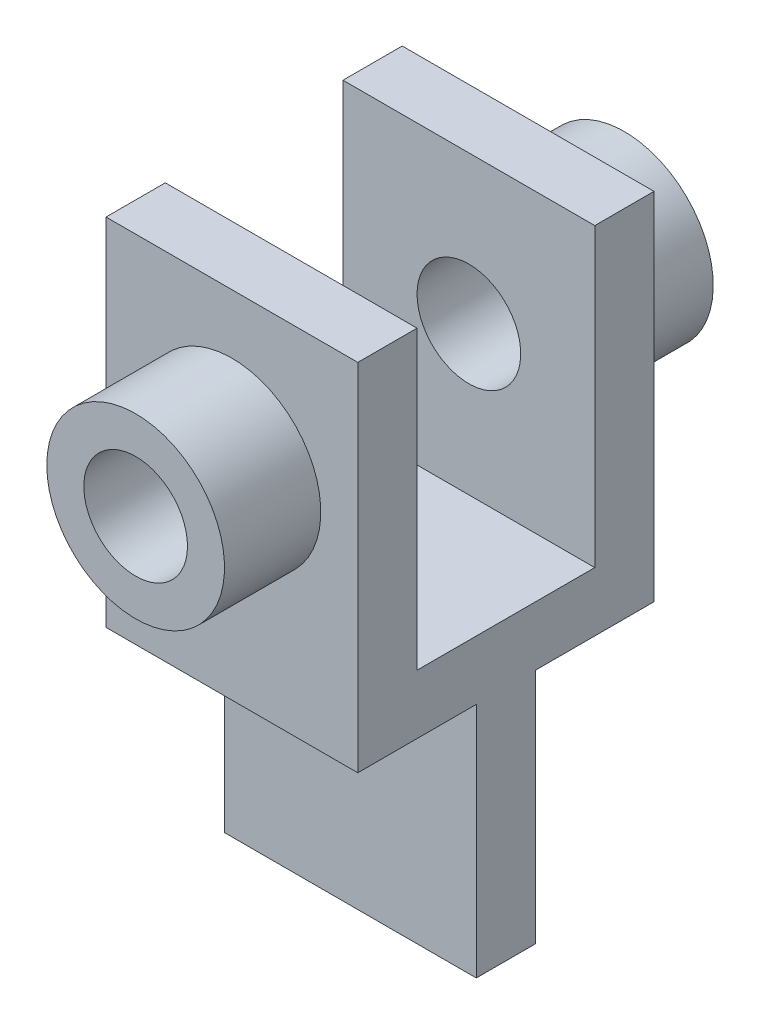
ISO-10303-21;
HEADER;
FILE_DESCRIPTION(('STEP AP214'),'2;1');
FILE_NAME('part.step','',(''),(''),'','','');
FILE_SCHEMA(('AUTOMOTIVE_DESIGN { 1 0 10303 214 1 1 1 1 }'));
ENDSEC;
DATA;
#1=APPLICATION_CONTEXT('core data for automotive mechanical design processes');
#2=APPLICATION_PROTOCOL_DEFINITION('international standard','automotive_design',2000,#1);
#3=PRODUCT_CONTEXT('',#1,'mechanical');
#4=PRODUCT('Part','Part','',(#3));
#5=PRODUCT_RELATED_PRODUCT_CATEGORY('part','',(#4));
#6=PRODUCT_DEFINITION_FORMATION('','',#4);
#7=PRODUCT_DEFINITION_CONTEXT('part definition',#1,'design');
#8=PRODUCT_DEFINITION('design','',#6,#7);
#9=PRODUCT_DEFINITION_SHAPE('','',#8);
#10=(LENGTH_UNIT() NAMED_UNIT(*) SI_UNIT(.MILLI.,.METRE.));
#11=(NAMED_UNIT(*) PLANE_ANGLE_UNIT() SI_UNIT($,.RADIAN.));
#12=(NAMED_UNIT(*) SI_UNIT($,.STERADIAN.) SOLID_ANGLE_UNIT());
#13=UNCERTAINTY_MEASURE_WITH_UNIT(LENGTH_MEASURE(1.E-05),#10,'distance_accuracy_value','');
#14=(GEOMETRIC_REPRESENTATION_CONTEXT(3) GLOBAL_UNCERTAINTY_ASSIGNED_CONTEXT((#13)) GLOBAL_UNIT_ASSIGNED_CONTEXT((#10,
#11,#12)) REPRESENTATION_CONTEXT('',''));
#15=CARTESIAN_POINT('',(0.,0.,0.));
#16=DIRECTION('',(0.,0.,1.));
#17=DIRECTION('',(1.,0.,0.));
#18=AXIS2_PLACEMENT_3D('',#15,#16,#17);
#19=CARTESIAN_POINT('',(17.,80.,-24.));
#20=DIRECTION('',(0.,0.,1.));
#21=DIRECTION('',(0.,-1.,0.));
#22=AXIS2_PLACEMENT_3D('',#19,#20,#21);
#23=PLANE('',#22);
#24=DIRECTION('',(0.,1.,0.));
#25=VECTOR('',#24,1.);
#26=CARTESIAN_POINT('',(-17.,80.,-24.));
#27=LINE('',#26,#25);
#28=CARTESIAN_POINT('',(-17.,32.,-24.));
#29=VERTEX_POINT('',#28);
#30=CARTESIAN_POINT('',(-17.,80.,-24.));
#31=VERTEX_POINT('',#30);
#32=EDGE_CURVE('E170',#29,#31,#27,.T.);
#33=ORIENTED_EDGE('',*,*,#32,.T.);
#34=DIRECTION('',(-1.,0.,0.));
#35=VECTOR('',#34,1.);
#36=CARTESIAN_POINT('',(17.,80.,-24.));
#37=LINE('',#36,#35);
#38=CARTESIAN_POINT('',(17.,80.,-24.));
#39=VERTEX_POINT('',#38);
#40=EDGE_CURVE('E201',#39,#31,#37,.T.);
#41=ORIENTED_EDGE('',*,*,#40,.F.);
#42=DIRECTION('',(0.,1.,0.));
#43=VECTOR('',#42,1.);
#44=CARTESIAN_POINT('',(17.,80.,-24.));
#45=LINE('',#44,#43);
#46=CARTESIAN_POINT('',(17.,32.,-24.));
#47=VERTEX_POINT('',#46);
#48=EDGE_CURVE('E274',#47,#39,#45,.T.);
#49=ORIENTED_EDGE('',*,*,#48,.F.);
#50=DIRECTION('',(-1.,0.,0.));
#51=VECTOR('',#50,1.);
#52=CARTESIAN_POINT('',(17.,32.,-24.));
#53=LINE('',#52,#51);
#54=EDGE_CURVE('E204',#47,#29,#53,.T.);
#55=ORIENTED_EDGE('',*,*,#54,.T.);
#56=EDGE_LOOP('',(#33,#41,#49,#55));
#57=FACE_BOUND('',#56,.T.);
#58=CARTESIAN_POINT('',(0.,60.,-24.));
#59=DIRECTION('',(0.,0.,1.));
#60=DIRECTION('',(0.,-1.,0.));
#61=AXIS2_PLACEMENT_3D('',#58,#59,#60);
#62=CIRCLE('',#61,12.);
#63=CARTESIAN_POINT('',(0.,48.,-24.));
#64=VERTEX_POINT('',#63);
#65=EDGE_CURVE('E11',#64,#64,#62,.F.);
#66=ORIENTED_EDGE('',*,*,#65,.F.);
#67=EDGE_LOOP('',(#66));
#68=FACE_BOUND('',#67,.T.);
#69=ADVANCED_FACE('F39',(#57,#68),#23,.F.);
#70=CARTESIAN_POINT('',(17.,32.,16.));
#71=DIRECTION('',(0.,0.,-1.));
#72=DIRECTION('',(-1.,0.,0.));
#73=AXIS2_PLACEMENT_3D('',#70,#71,#72);
#74=PLANE('',#73);
#75=DIRECTION('',(0.,-1.,0.));
#76=VECTOR('',#75,1.);
#77=CARTESIAN_POINT('',(-17.,32.,16.));
#78=LINE('',#77,#76);
#79=CARTESIAN_POINT('',(-17.,80.,16.));
#80=VERTEX_POINT('',#79);
#81=CARTESIAN_POINT('',(-17.,32.,16.));
#82=VERTEX_POINT('',#81);
#83=EDGE_CURVE('E152',#80,#82,#78,.T.);
#84=ORIENTED_EDGE('',*,*,#83,.T.);
#85=DIRECTION('',(-1.,0.,0.));
#86=VECTOR('',#85,1.);
#87=CARTESIAN_POINT('',(17.,32.,16.));
#88=LINE('',#87,#86);
#89=CARTESIAN_POINT('',(17.,32.,16.));
#90=VERTEX_POINT('',#89);
#91=EDGE_CURVE('E148',#90,#82,#88,.T.);
#92=ORIENTED_EDGE('',*,*,#91,.F.);
#93=DIRECTION('',(0.,-1.,0.));
#94=VECTOR('',#93,1.);
#95=CARTESIAN_POINT('',(17.,32.,16.));
#96=LINE('',#95,#94);
#97=CARTESIAN_POINT('',(17.,80.,16.));
#98=VERTEX_POINT('',#97);
#99=EDGE_CURVE('E137',#98,#90,#96,.T.);
#100=ORIENTED_EDGE('',*,*,#99,.F.);
#101=DIRECTION('',(-1.,0.,0.));
#102=VECTOR('',#101,1.);
#103=CARTESIAN_POINT('',(17.,80.,16.));
#104=LINE('',#103,#102);
#105=EDGE_CURVE('E153',#98,#80,#104,.T.);
#106=ORIENTED_EDGE('',*,*,#105,.T.);
#107=EDGE_LOOP('',(#84,#92,#100,#106));
#108=FACE_BOUND('',#107,.T.);
#109=CARTESIAN_POINT('',(0.,60.,16.));
#110=DIRECTION('',(0.,0.,-1.));
#111=DIRECTION('',(-1.,0.,0.));
#112=AXIS2_PLACEMENT_3D('',#109,#110,#111);
#113=CIRCLE('',#112,12.);
#114=CARTESIAN_POINT('',(-12.,60.,16.));
#115=VERTEX_POINT('',#114);
#116=EDGE_CURVE('E48',#115,#115,#113,.F.);
#117=ORIENTED_EDGE('',*,*,#116,.F.);
#118=EDGE_LOOP('',(#117));
#119=FACE_BOUND('',#118,.T.);
#120=ADVANCED_FACE('F149',(#108,#119),#74,.F.);
#121=CARTESIAN_POINT('',(17.,0.,-8.00000000000001));
#122=DIRECTION('',(0.,1.,0.));
#123=DIRECTION('',(0.,0.,1.));
#124=AXIS2_PLACEMENT_3D('',#121,#122,#123);
#125=PLANE('',#124);
#126=DIRECTION('',(0.,0.,-1.));
#127=VECTOR('',#126,1.);
#128=CARTESIAN_POINT('',(-17.,0.,-8.00000000000001));
#129=LINE('',#128,#127);
#130=CARTESIAN_POINT('',(-17.,0.,0.));
#131=VERTEX_POINT('',#130);
#132=CARTESIAN_POINT('',(-17.,0.,-8.00000000000001));
#133=VERTEX_POINT('',#132);
#134=EDGE_CURVE('E162',#131,#133,#129,.T.);
#135=ORIENTED_EDGE('',*,*,#134,.T.);
#136=DIRECTION('',(-1.,0.,0.));
#137=VECTOR('',#136,1.);
#138=CARTESIAN_POINT('',(17.,0.,-8.00000000000001));
#139=LINE('',#138,#137);
#140=CARTESIAN_POINT('',(17.,0.,-8.00000000000001));
#141=VERTEX_POINT('',#140);
#142=EDGE_CURVE('E210',#141,#133,#139,.T.);
#143=ORIENTED_EDGE('',*,*,#142,.F.);
#144=DIRECTION('',(0.,0.,-1.));
#145=VECTOR('',#144,1.);
#146=CARTESIAN_POINT('',(17.,0.,-8.00000000000001));
#147=LINE('',#146,#145);
#148=CARTESIAN_POINT('',(17.,0.,0.));
#149=VERTEX_POINT('',#148);
#150=EDGE_CURVE('E185',#149,#141,#147,.T.);
#151=ORIENTED_EDGE('',*,*,#150,.F.);
#152=DIRECTION('',(-1.,0.,0.));
#153=VECTOR('',#152,1.);
#154=CARTESIAN_POINT('',(17.,0.,0.));
#155=LINE('',#154,#153);
#156=EDGE_CURVE('E158',#149,#131,#155,.T.);
#157=ORIENTED_EDGE('',*,*,#156,.T.);
#158=EDGE_LOOP('',(#135,#143,#151,#157));
#159=FACE_BOUND('',#158,.T.);
#160=ADVANCED_FACE('F41',(#159),#125,.F.);
#161=CARTESIAN_POINT('',(17.,32.,-8.));
#162=DIRECTION('',(0.,0.,1.));
#163=DIRECTION('',(0.,-1.,0.));
#164=AXIS2_PLACEMENT_3D('',#161,#162,#163);
#165=PLANE('',#164);
#166=DIRECTION('',(0.,1.,0.));
#167=VECTOR('',#166,1.);
#168=CARTESIAN_POINT('',(-17.,32.,-8.));
#169=LINE('',#168,#167);
#170=CARTESIAN_POINT('',(-17.,32.,-8.));
#171=VERTEX_POINT('',#170);
#172=EDGE_CURVE('E165',#133,#171,#169,.T.);
#173=ORIENTED_EDGE('',*,*,#172,.T.);
#174=DIRECTION('',(-1.,0.,0.));
#175=VECTOR('',#174,1.);
#176=CARTESIAN_POINT('',(17.,32.,-8.));
#177=LINE('',#176,#175);
#178=CARTESIAN_POINT('',(17.,32.,-8.));
#179=VERTEX_POINT('',#178);
#180=EDGE_CURVE('E207',#179,#171,#177,.T.);
#181=ORIENTED_EDGE('',*,*,#180,.F.);
#182=DIRECTION('',(0.,1.,0.));
#183=VECTOR('',#182,1.);
#184=CARTESIAN_POINT('',(17.,32.,-8.));
#185=LINE('',#184,#183);
#186=EDGE_CURVE('E112',#141,#179,#185,.T.);
#187=ORIENTED_EDGE('',*,*,#186,.F.);
#188=ORIENTED_EDGE('',*,*,#142,.T.);
#189=EDGE_LOOP('',(#173,#181,#187,#188));
#190=FACE_BOUND('',#189,.T.);
#191=ADVANCED_FACE('F222',(#190),#165,.F.);
#192=CARTESIAN_POINT('',(17.,32.,-24.));
#193=DIRECTION('',(0.,1.,0.));
#194=DIRECTION('',(0.,0.,1.));
#195=AXIS2_PLACEMENT_3D('',#192,#193,#194);
#196=PLANE('',#195);
#197=DIRECTION('',(0.,0.,-1.));
#198=VECTOR('',#197,1.);
#199=CARTESIAN_POINT('',(-17.,32.,-24.));
#200=LINE('',#199,#198);
#201=EDGE_CURVE('E168',#171,#29,#200,.T.);
#202=ORIENTED_EDGE('',*,*,#201,.T.);
#203=ORIENTED_EDGE('',*,*,#54,.F.);
#204=DIRECTION('',(0.,0.,-1.));
#205=VECTOR('',#204,1.);
#206=CARTESIAN_POINT('',(17.,32.,-24.));
#207=LINE('',#206,#205);
#208=EDGE_CURVE('E261',#179,#47,#207,.T.);
#209=ORIENTED_EDGE('',*,*,#208,.F.);
#210=ORIENTED_EDGE('',*,*,#180,.T.);
#211=EDGE_LOOP('',(#202,#203,#209,#210));
#212=FACE_BOUND('',#211,.T.);
#213=ADVANCED_FACE('F247',(#212),#196,.F.);
#214=CARTESIAN_POINT('',(17.,80.,-16.));
#215=DIRECTION('',(0.,-1.,0.));
#216=DIRECTION('',(0.,0.,-1.));
#217=AXIS2_PLACEMENT_3D('',#214,#215,#216);
#218=PLANE('',#217);
#219=DIRECTION('',(0.,0.,1.));
#220=VECTOR('',#219,1.);
#221=CARTESIAN_POINT('',(-17.,80.,-16.));
#222=LINE('',#221,#220);
#223=CARTESIAN_POINT('',(-17.,80.,-16.));
#224=VERTEX_POINT('',#223);
#225=EDGE_CURVE('E172',#31,#224,#222,.T.);
#226=ORIENTED_EDGE('',*,*,#225,.T.);
#227=DIRECTION('',(-1.,0.,0.));
#228=VECTOR('',#227,1.);
#229=CARTESIAN_POINT('',(17.,80.,-16.));
#230=LINE('',#229,#228);
#231=CARTESIAN_POINT('',(17.,80.,-16.));
#232=VERTEX_POINT('',#231);
#233=EDGE_CURVE('E198',#232,#224,#230,.T.);
#234=ORIENTED_EDGE('',*,*,#233,.F.);
#235=DIRECTION('',(0.,0.,1.));
#236=VECTOR('',#235,1.);
#237=CARTESIAN_POINT('',(17.,80.,-16.));
#238=LINE('',#237,#236);
#239=EDGE_CURVE('E271',#39,#232,#238,.T.);
#240=ORIENTED_EDGE('',*,*,#239,.F.);
#241=ORIENTED_EDGE('',*,*,#40,.T.);
#242=EDGE_LOOP('',(#226,#234,#240,#241));
#243=FACE_BOUND('',#242,.T.);
#244=ADVANCED_FACE('F244',(#243),#218,.F.);
#245=CARTESIAN_POINT('',(17.,40.,-16.));
#246=DIRECTION('',(0.,0.,-1.));
#247=DIRECTION('',(-1.,0.,0.));
#248=AXIS2_PLACEMENT_3D('',#245,#246,#247);
#249=PLANE('',#248);
#250=CARTESIAN_POINT('',(0.,60.,-16.));
#251=DIRECTION('',(0.,0.,-1.));
#252=DIRECTION('',(-1.,0.,0.));
#253=AXIS2_PLACEMENT_3D('',#250,#251,#252);
#254=CIRCLE('',#253,7.);
#255=CARTESIAN_POINT('',(-7.,60.,-16.));
#256=VERTEX_POINT('',#255);
#257=EDGE_CURVE('E166',#256,#256,#254,.T.);
#258=ORIENTED_EDGE('',*,*,#257,.T.);
#259=EDGE_LOOP('',(#258));
#260=FACE_BOUND('',#259,.T.);
#261=DIRECTION('',(0.,-1.,0.));
#262=VECTOR('',#261,1.);
#263=CARTESIAN_POINT('',(-17.,40.,-16.));
#264=LINE('',#263,#262);
#265=CARTESIAN_POINT('',(-17.,40.,-16.));
#266=VERTEX_POINT('',#265);
#267=EDGE_CURVE('E174',#224,#266,#264,.T.);
#268=ORIENTED_EDGE('',*,*,#267,.T.);
#269=DIRECTION('',(-1.,0.,0.));
#270=VECTOR('',#269,1.);
#271=CARTESIAN_POINT('',(17.,40.,-16.));
#272=LINE('',#271,#270);
#273=CARTESIAN_POINT('',(17.,40.,-16.));
#274=VERTEX_POINT('',#273);
#275=EDGE_CURVE('E195',#274,#266,#272,.T.);
#276=ORIENTED_EDGE('',*,*,#275,.F.);
#277=DIRECTION('',(0.,-1.,0.));
#278=VECTOR('',#277,1.);
#279=CARTESIAN_POINT('',(17.,40.,-16.));
#280=LINE('',#279,#278);
#281=EDGE_CURVE('E273',#232,#274,#280,.T.);
#282=ORIENTED_EDGE('',*,*,#281,.F.);
#283=ORIENTED_EDGE('',*,*,#233,.T.);
#284=EDGE_LOOP('',(#268,#276,#282,#283));
#285=FACE_BOUND('',#284,.T.);
#286=ADVANCED_FACE('F240',(#260,#285),#249,.F.);
#287=CARTESIAN_POINT('',(17.,40.,8.));
#288=DIRECTION('',(0.,-1.,0.));
#289=DIRECTION('',(0.,0.,-1.));
#290=AXIS2_PLACEMENT_3D('',#287,#288,#289);
#291=PLANE('',#290);
#292=DIRECTION('',(0.,0.,1.));
#293=VECTOR('',#292,1.);
#294=CARTESIAN_POINT('',(-17.,40.,8.));
#295=LINE('',#294,#293);
#296=CARTESIAN_POINT('',(-17.,40.,8.));
#297=VERTEX_POINT('',#296);
#298=EDGE_CURVE('E176',#266,#297,#295,.T.);
#299=ORIENTED_EDGE('',*,*,#298,.T.);
#300=DIRECTION('',(-1.,0.,0.));
#301=VECTOR('',#300,1.);
#302=CARTESIAN_POINT('',(17.,40.,8.));
#303=LINE('',#302,#301);
#304=CARTESIAN_POINT('',(17.,40.,8.));
#305=VERTEX_POINT('',#304);
#306=EDGE_CURVE('E192',#305,#297,#303,.T.);
#307=ORIENTED_EDGE('',*,*,#306,.F.);
#308=DIRECTION('',(0.,0.,1.));
#309=VECTOR('',#308,1.);
#310=CARTESIAN_POINT('',(17.,40.,8.));
#311=LINE('',#310,#309);
#312=EDGE_CURVE('E276',#274,#305,#311,.T.);
#313=ORIENTED_EDGE('',*,*,#312,.F.);
#314=ORIENTED_EDGE('',*,*,#275,.T.);
#315=EDGE_LOOP('',(#299,#307,#313,#314));
#316=FACE_BOUND('',#315,.T.);
#317=ADVANCED_FACE('F236',(#316),#291,.F.);
#318=CARTESIAN_POINT('',(17.,80.,8.));
#319=DIRECTION('',(0.,0.,1.));
#320=DIRECTION('',(0.,-1.,0.));
#321=AXIS2_PLACEMENT_3D('',#318,#319,#320);
#322=PLANE('',#321);
#323=CARTESIAN_POINT('',(0.,60.,8.));
#324=DIRECTION('',(0.,0.,1.));
#325=DIRECTION('',(0.,-1.,0.));
#326=AXIS2_PLACEMENT_3D('',#323,#324,#325);
#327=CIRCLE('',#326,7.);
#328=CARTESIAN_POINT('',(0.,53.,8.));
#329=VERTEX_POINT('',#328);
#330=EDGE_CURVE('E339',#329,#329,#327,.T.);
#331=ORIENTED_EDGE('',*,*,#330,.T.);
#332=EDGE_LOOP('',(#331));
#333=FACE_BOUND('',#332,.T.);
#334=DIRECTION('',(0.,1.,0.));
#335=VECTOR('',#334,1.);
#336=CARTESIAN_POINT('',(-17.,80.,8.));
#337=LINE('',#336,#335);
#338=CARTESIAN_POINT('',(-17.,80.,8.));
#339=VERTEX_POINT('',#338);
#340=EDGE_CURVE('E178',#297,#339,#337,.T.);
#341=ORIENTED_EDGE('',*,*,#340,.T.);
#342=DIRECTION('',(-1.,0.,0.));
#343=VECTOR('',#342,1.);
#344=CARTESIAN_POINT('',(17.,80.,8.));
#345=LINE('',#344,#343);
#346=CARTESIAN_POINT('',(17.,80.,8.));
#347=VERTEX_POINT('',#346);
#348=EDGE_CURVE('E189',#347,#339,#345,.T.);
#349=ORIENTED_EDGE('',*,*,#348,.F.);
#350=DIRECTION('',(0.,1.,0.));
#351=VECTOR('',#350,1.);
#352=CARTESIAN_POINT('',(17.,80.,8.));
#353=LINE('',#352,#351);
#354=EDGE_CURVE('E282',#305,#347,#353,.T.);
#355=ORIENTED_EDGE('',*,*,#354,.F.);
#356=ORIENTED_EDGE('',*,*,#306,.T.);
#357=EDGE_LOOP('',(#341,#349,#355,#356));
#358=FACE_BOUND('',#357,.T.);
#359=ADVANCED_FACE('F233',(#333,#358),#322,.F.);
#360=CARTESIAN_POINT('',(17.,80.,16.));
#361=DIRECTION('',(0.,-1.,0.));
#362=DIRECTION('',(0.,0.,-1.));
#363=AXIS2_PLACEMENT_3D('',#360,#361,#362);
#364=PLANE('',#363);
#365=DIRECTION('',(0.,0.,1.));
#366=VECTOR('',#365,1.);
#367=CARTESIAN_POINT('',(-17.,80.,16.));
#368=LINE('',#367,#366);
#369=EDGE_CURVE('E180',#339,#80,#368,.T.);
#370=ORIENTED_EDGE('',*,*,#369,.T.);
#371=ORIENTED_EDGE('',*,*,#105,.F.);
#372=DIRECTION('',(0.,0.,1.));
#373=VECTOR('',#372,1.);
#374=CARTESIAN_POINT('',(17.,80.,16.));
#375=LINE('',#374,#373);
#376=EDGE_CURVE('E143',#347,#98,#375,.T.);
#377=ORIENTED_EDGE('',*,*,#376,.F.);
#378=ORIENTED_EDGE('',*,*,#348,.T.);
#379=EDGE_LOOP('',(#370,#371,#377,#378));
#380=FACE_BOUND('',#379,.T.);
#381=ADVANCED_FACE('F230',(#380),#364,.F.);
#382=CARTESIAN_POINT('',(17.,32.,0.));
#383=DIRECTION('',(0.,1.,0.));
#384=DIRECTION('',(0.,0.,1.));
#385=AXIS2_PLACEMENT_3D('',#382,#383,#384);
#386=PLANE('',#385);
#387=DIRECTION('',(0.,0.,-1.));
#388=VECTOR('',#387,1.);
#389=CARTESIAN_POINT('',(-17.,32.,0.));
#390=LINE('',#389,#388);
#391=CARTESIAN_POINT('',(-17.,32.,0.));
#392=VERTEX_POINT('',#391);
#393=EDGE_CURVE('E97',#82,#392,#390,.T.);
#394=ORIENTED_EDGE('',*,*,#393,.T.);
#395=DIRECTION('',(-1.,0.,0.));
#396=VECTOR('',#395,1.);
#397=CARTESIAN_POINT('',(17.,32.,0.));
#398=LINE('',#397,#396);
#399=CARTESIAN_POINT('',(17.,32.,0.));
#400=VERTEX_POINT('',#399);
#401=EDGE_CURVE('E154',#400,#392,#398,.T.);
#402=ORIENTED_EDGE('',*,*,#401,.F.);
#403=DIRECTION('',(0.,0.,-1.));
#404=VECTOR('',#403,1.);
#405=CARTESIAN_POINT('',(17.,32.,0.));
#406=LINE('',#405,#404);
#407=EDGE_CURVE('E141',#90,#400,#406,.T.);
#408=ORIENTED_EDGE('',*,*,#407,.F.);
#409=ORIENTED_EDGE('',*,*,#91,.T.);
#410=EDGE_LOOP('',(#394,#402,#408,#409));
#411=FACE_BOUND('',#410,.T.);
#412=ADVANCED_FACE('F156',(#411),#386,.F.);
#413=CARTESIAN_POINT('',(17.,0.,0.));
#414=DIRECTION('',(0.,0.,-1.));
#415=DIRECTION('',(0.,1.,0.));
#416=AXIS2_PLACEMENT_3D('',#413,#414,#415);
#417=PLANE('',#416);
#418=DIRECTION('',(0.,-1.,0.));
#419=VECTOR('',#418,1.);
#420=CARTESIAN_POINT('',(-17.,0.,0.));
#421=LINE('',#420,#419);
#422=EDGE_CURVE('E103',#392,#131,#421,.T.);
#423=ORIENTED_EDGE('',*,*,#422,.T.);
#424=ORIENTED_EDGE('',*,*,#156,.F.);
#425=DIRECTION('',(0.,-1.,0.));
#426=VECTOR('',#425,1.);
#427=CARTESIAN_POINT('',(17.,0.,0.));
#428=LINE('',#427,#426);
#429=EDGE_CURVE('E56',#400,#149,#428,.T.);
#430=ORIENTED_EDGE('',*,*,#429,.F.);
#431=ORIENTED_EDGE('',*,*,#401,.T.);
#432=EDGE_LOOP('',(#423,#424,#430,#431));
#433=FACE_BOUND('',#432,.T.);
#434=ADVANCED_FACE('F291',(#433),#417,.F.);
#435=CARTESIAN_POINT('',(17.,0.,0.));
#436=DIRECTION('',(-1.,0.,0.));
#437=DIRECTION('',(0.,0.,1.));
#438=AXIS2_PLACEMENT_3D('',#435,#436,#437);
#439=PLANE('',#438);
#440=ORIENTED_EDGE('',*,*,#150,.T.);
#441=ORIENTED_EDGE('',*,*,#186,.T.);
#442=ORIENTED_EDGE('',*,*,#208,.T.);
#443=ORIENTED_EDGE('',*,*,#48,.T.);
#444=ORIENTED_EDGE('',*,*,#239,.T.);
#445=ORIENTED_EDGE('',*,*,#281,.T.);
#446=ORIENTED_EDGE('',*,*,#312,.T.);
#447=ORIENTED_EDGE('',*,*,#354,.T.);
#448=ORIENTED_EDGE('',*,*,#376,.T.);
#449=ORIENTED_EDGE('',*,*,#99,.T.);
#450=ORIENTED_EDGE('',*,*,#407,.T.);
#451=ORIENTED_EDGE('',*,*,#429,.T.);
#452=EDGE_LOOP('',(#440,#441,#442,#443,#444,#445,#446,#447,#448,#449,#450,#451));
#453=FACE_BOUND('',#452,.T.);
#454=ADVANCED_FACE('F139',(#453),#439,.F.);
#455=CARTESIAN_POINT('',(-17.,0.,0.));
#456=DIRECTION('',(-1.,0.,0.));
#457=DIRECTION('',(0.,0.,1.));
#458=AXIS2_PLACEMENT_3D('',#455,#456,#457);
#459=PLANE('',#458);
#460=ORIENTED_EDGE('',*,*,#134,.F.);
#461=ORIENTED_EDGE('',*,*,#422,.F.);
#462=ORIENTED_EDGE('',*,*,#393,.F.);
#463=ORIENTED_EDGE('',*,*,#83,.F.);
#464=ORIENTED_EDGE('',*,*,#369,.F.);
#465=ORIENTED_EDGE('',*,*,#340,.F.);
#466=ORIENTED_EDGE('',*,*,#298,.F.);
#467=ORIENTED_EDGE('',*,*,#267,.F.);
#468=ORIENTED_EDGE('',*,*,#225,.F.);
#469=ORIENTED_EDGE('',*,*,#32,.F.);
#470=ORIENTED_EDGE('',*,*,#201,.F.);
#471=ORIENTED_EDGE('',*,*,#172,.F.);
#472=EDGE_LOOP('',(#460,#461,#462,#463,#464,#465,#466,#467,#468,#469,#470,#471));
#473=FACE_BOUND('',#472,.T.);
#474=ADVANCED_FACE('F263',(#473),#459,.T.);
#475=CARTESIAN_POINT('',(0.,60.,-24.));
#476=DIRECTION('',(0.,0.,1.));
#477=DIRECTION('',(1.,0.,0.));
#478=AXIS2_PLACEMENT_3D('',#475,#476,#477);
#479=CYLINDRICAL_SURFACE('',#478,7.);
#480=ORIENTED_EDGE('',*,*,#330,.F.);
#481=EDGE_LOOP('',(#480));
#482=FACE_BOUND('',#481,.T.);
#483=CARTESIAN_POINT('',(0.,60.,29.));
#484=DIRECTION('',(0.,0.,1.));
#485=DIRECTION('',(1.,0.,0.));
#486=AXIS2_PLACEMENT_3D('',#483,#484,#485);
#487=CIRCLE('',#486,7.);
#488=CARTESIAN_POINT('',(7.,60.,29.));
#489=VERTEX_POINT('',#488);
#490=EDGE_CURVE('E331',#489,#489,#487,.T.);
#491=ORIENTED_EDGE('',*,*,#490,.T.);
#492=EDGE_LOOP('',(#491));
#493=FACE_BOUND('',#492,.T.);
#494=ADVANCED_FACE('F300',(#482,#493),#479,.F.);
#495=ORIENTED_EDGE('',*,*,#257,.F.);
#496=EDGE_LOOP('',(#495));
#497=FACE_BOUND('',#496,.T.);
#498=CARTESIAN_POINT('',(0.,60.,-37.));
#499=DIRECTION('',(0.,0.,-1.));
#500=DIRECTION('',(0.,1.,0.));
#501=AXIS2_PLACEMENT_3D('',#498,#499,#500);
#502=CIRCLE('',#501,7.);
#503=CARTESIAN_POINT('',(0.,67.,-37.));
#504=VERTEX_POINT('',#503);
#505=EDGE_CURVE('E328',#504,#504,#502,.T.);
#506=ORIENTED_EDGE('',*,*,#505,.T.);
#507=EDGE_LOOP('',(#506));
#508=FACE_BOUND('',#507,.T.);
#509=ADVANCED_FACE('F302',(#497,#508),#479,.F.);
#510=CARTESIAN_POINT('',(0.,60.,29.));
#511=DIRECTION('',(0.,0.,1.));
#512=DIRECTION('',(1.,0.,0.));
#513=AXIS2_PLACEMENT_3D('',#510,#511,#512);
#514=PLANE('',#513);
#515=CARTESIAN_POINT('',(0.,60.,29.));
#516=DIRECTION('',(0.,0.,1.));
#517=DIRECTION('',(1.,0.,0.));
#518=AXIS2_PLACEMENT_3D('',#515,#516,#517);
#519=CIRCLE('',#518,12.);
#520=CARTESIAN_POINT('',(-12.,60.,29.));
#521=VERTEX_POINT('',#520);
#522=EDGE_CURVE('E336',#521,#521,#519,.T.);
#523=ORIENTED_EDGE('',*,*,#522,.T.);
#524=EDGE_LOOP('',(#523));
#525=FACE_BOUND('',#524,.T.);
#526=ORIENTED_EDGE('',*,*,#490,.F.);
#527=EDGE_LOOP('',(#526));
#528=FACE_BOUND('',#527,.T.);
#529=ADVANCED_FACE('F305',(#525,#528),#514,.T.);
#530=CARTESIAN_POINT('',(0.,60.,29.));
#531=DIRECTION('',(0.,0.,-1.));
#532=DIRECTION('',(-1.,0.,0.));
#533=AXIS2_PLACEMENT_3D('',#530,#531,#532);
#534=CYLINDRICAL_SURFACE('',#533,12.);
#535=CARTESIAN_POINT('',(-12.,60.,29.));
#536=CARTESIAN_POINT('',(-12.,60.,28.8645833333333));
#537=CARTESIAN_POINT('',(-12.,60.,28.7291666666667));
#538=CARTESIAN_POINT('',(-12.,60.,28.4583333333333));
#539=CARTESIAN_POINT('',(-12.,60.,28.3229166666667));
#540=CARTESIAN_POINT('',(-12.,60.,28.0520833333333));
#541=CARTESIAN_POINT('',(-12.,60.,27.9166666666667));
#542=CARTESIAN_POINT('',(-12.,60.,27.6458333333333));
#543=CARTESIAN_POINT('',(-12.,60.,27.5104166666667));
#544=CARTESIAN_POINT('',(-12.,60.,27.2395833333333));
#545=CARTESIAN_POINT('',(-12.,60.,27.1041666666667));
#546=CARTESIAN_POINT('',(-12.,60.,26.8333333333333));
#547=CARTESIAN_POINT('',(-12.,60.,26.6979166666667));
#548=CARTESIAN_POINT('',(-12.,60.,26.4270833333333));
#549=CARTESIAN_POINT('',(-12.,60.,26.2916666666667));
#550=CARTESIAN_POINT('',(-12.,60.,26.0208333333333));
#551=CARTESIAN_POINT('',(-12.,60.,25.8854166666667));
#552=CARTESIAN_POINT('',(-12.,60.,25.6145833333333));
#553=CARTESIAN_POINT('',(-12.,60.,25.4791666666667));
#554=CARTESIAN_POINT('',(-12.,60.,25.2083333333333));
#555=CARTESIAN_POINT('',(-12.,60.,25.0729166666667));
#556=CARTESIAN_POINT('',(-12.,60.,24.8020833333333));
#557=CARTESIAN_POINT('',(-12.,60.,24.6666666666667));
#558=CARTESIAN_POINT('',(-12.,60.,24.3958333333333));
#559=CARTESIAN_POINT('',(-12.,60.,24.2604166666667));
#560=CARTESIAN_POINT('',(-12.,60.,23.9895833333333));
#561=CARTESIAN_POINT('',(-12.,60.,23.8541666666667));
#562=CARTESIAN_POINT('',(-12.,60.,23.5833333333333));
#563=CARTESIAN_POINT('',(-12.,60.,23.4479166666667));
#564=CARTESIAN_POINT('',(-12.,60.,23.1770833333333));
#565=CARTESIAN_POINT('',(-12.,60.,23.0416666666667));
#566=CARTESIAN_POINT('',(-12.,60.,22.7708333333333));
#567=CARTESIAN_POINT('',(-12.,60.,22.6354166666667));
#568=CARTESIAN_POINT('',(-12.,60.,22.3645833333333));
#569=CARTESIAN_POINT('',(-12.,60.,22.2291666666667));
#570=CARTESIAN_POINT('',(-12.,60.,21.9583333333333));
#571=CARTESIAN_POINT('',(-12.,60.,21.8229166666667));
#572=CARTESIAN_POINT('',(-12.,60.,21.5520833333333));
#573=CARTESIAN_POINT('',(-12.,60.,21.4166666666667));
#574=CARTESIAN_POINT('',(-12.,60.,21.1458333333333));
#575=CARTESIAN_POINT('',(-12.,60.,21.0104166666667));
#576=CARTESIAN_POINT('',(-12.,60.,20.7395833333333));
#577=CARTESIAN_POINT('',(-12.,60.,20.6041666666667));
#578=CARTESIAN_POINT('',(-12.,60.,20.3333333333333));
#579=CARTESIAN_POINT('',(-12.,60.,20.1979166666667));
#580=CARTESIAN_POINT('',(-12.,60.,19.9270833333333));
#581=CARTESIAN_POINT('',(-12.,60.,19.7916666666667));
#582=CARTESIAN_POINT('',(-12.,60.,19.5208333333333));
#583=CARTESIAN_POINT('',(-12.,60.,19.3854166666667));
#584=CARTESIAN_POINT('',(-12.,60.,19.1145833333333));
#585=CARTESIAN_POINT('',(-12.,60.,18.9791666666667));
#586=CARTESIAN_POINT('',(-12.,60.,18.7083333333333));
#587=CARTESIAN_POINT('',(-12.,60.,18.5729166666667));
#588=CARTESIAN_POINT('',(-12.,60.,18.3020833333333));
#589=CARTESIAN_POINT('',(-12.,60.,18.1666666666667));
#590=CARTESIAN_POINT('',(-12.,60.,17.8958333333333));
#591=CARTESIAN_POINT('',(-12.,60.,17.7604166666667));
#592=CARTESIAN_POINT('',(-12.,60.,17.4895833333333));
#593=CARTESIAN_POINT('',(-12.,60.,17.3541666666667));
#594=CARTESIAN_POINT('',(-12.,60.,17.0833333333333));
#595=CARTESIAN_POINT('',(-12.,60.,16.9479166666667));
#596=CARTESIAN_POINT('',(-12.,60.,16.6770833333333));
#597=CARTESIAN_POINT('',(-12.,60.,16.5416666666667));
#598=CARTESIAN_POINT('',(-12.,60.,16.2708333333333));
#599=CARTESIAN_POINT('',(-12.,60.,16.1354166666667));
#600=CARTESIAN_POINT('',(-12.,60.,16.));
#601=B_SPLINE_CURVE_WITH_KNOTS('',3,(#535,#536,#537,#538,#539,#540,#541,#542,#543,#544,#545,
#546,#547,#548,#549,#550,#551,#552,#553,#554,#555,#556,#557,#558,#559,#560,#561,#562,#563,#564,
#565,#566,#567,#568,#569,#570,#571,#572,#573,#574,#575,#576,#577,#578,#579,#580,#581,#582,#583,
#584,#585,#586,#587,#588,#589,#590,#591,#592,#593,#594,#595,#596,#597,#598,#599,#600),
.UNSPECIFIED.,.F.,.F.,(4,2,2,2,2,2,2,2,2,2,2,2,2,2,2,2,2,2,2,2,2,2,2,2,2,2,2,2,2,2,2,2,4),(0.,
0.40625,0.812500000000001,1.21875,1.625,2.03125,2.4375,2.84375,3.25,3.65625,4.0625,4.46875,
4.875,5.28125,5.6875,6.09375,6.5,6.90625,7.3125,7.71875,8.125,8.53125,8.9375,9.34375,
9.74999999999999,10.15625,10.5625,10.96875,11.375,11.78125,12.1875,12.59375,13.),.UNSPECIFIED.);
#602=EDGE_CURVE('BSEAM214',#521,#115,#601,.T.);
#603=ORIENTED_EDGE('',*,*,#522,.F.);
#604=ORIENTED_EDGE('',*,*,#116,.T.);
#605=ORIENTED_EDGE('',*,*,#602,.T.);
#606=ORIENTED_EDGE('',*,*,#602,.F.);
#607=EDGE_LOOP('',(#603,#605,#604,#606));
#608=FACE_BOUND('',#607,.T.);
#609=ADVANCED_FACE('F214',(#608),#534,.T.);
#610=CARTESIAN_POINT('',(0.,60.,-37.));
#611=DIRECTION('',(0.,0.,-1.));
#612=DIRECTION('',(0.,1.,0.));
#613=AXIS2_PLACEMENT_3D('',#610,#611,#612);
#614=PLANE('',#613);
#615=CARTESIAN_POINT('',(0.,60.,-37.));
#616=DIRECTION('',(0.,0.,-1.));
#617=DIRECTION('',(0.,1.,0.));
#618=AXIS2_PLACEMENT_3D('',#615,#616,#617);
#619=CIRCLE('',#618,12.);
#620=CARTESIAN_POINT('',(0.,48.,-37.));
#621=VERTEX_POINT('',#620);
#622=EDGE_CURVE('E325',#621,#621,#619,.T.);
#623=ORIENTED_EDGE('',*,*,#622,.T.);
#624=EDGE_LOOP('',(#623));
#625=FACE_BOUND('',#624,.T.);
#626=ORIENTED_EDGE('',*,*,#505,.F.);
#627=EDGE_LOOP('',(#626));
#628=FACE_BOUND('',#627,.T.);
#629=ADVANCED_FACE('F309',(#625,#628),#614,.T.);
#630=CARTESIAN_POINT('',(0.,60.,-37.));
#631=DIRECTION('',(0.,0.,1.));
#632=DIRECTION('',(0.,-1.,0.));
#633=AXIS2_PLACEMENT_3D('',#630,#631,#632);
#634=CYLINDRICAL_SURFACE('',#633,12.);
#635=CARTESIAN_POINT('',(0.,48.,-37.));
#636=CARTESIAN_POINT('',(0.,48.,-36.8645833333333));
#637=CARTESIAN_POINT('',(0.,48.,-36.7291666666667));
#638=CARTESIAN_POINT('',(0.,48.,-36.4583333333333));
#639=CARTESIAN_POINT('',(0.,48.,-36.3229166666667));
#640=CARTESIAN_POINT('',(0.,48.,-36.0520833333333));
#641=CARTESIAN_POINT('',(0.,48.,-35.9166666666667));
#642=CARTESIAN_POINT('',(0.,48.,-35.6458333333333));
#643=CARTESIAN_POINT('',(0.,48.,-35.5104166666667));
#644=CARTESIAN_POINT('',(0.,48.,-35.2395833333333));
#645=CARTESIAN_POINT('',(0.,48.,-35.1041666666667));
#646=CARTESIAN_POINT('',(0.,48.,-34.8333333333333));
#647=CARTESIAN_POINT('',(0.,48.,-34.6979166666667));
#648=CARTESIAN_POINT('',(0.,48.,-34.4270833333333));
#649=CARTESIAN_POINT('',(0.,48.,-34.2916666666667));
#650=CARTESIAN_POINT('',(0.,48.,-34.0208333333333));
#651=CARTESIAN_POINT('',(0.,48.,-33.8854166666667));
#652=CARTESIAN_POINT('',(0.,48.,-33.6145833333333));
#653=CARTESIAN_POINT('',(0.,48.,-33.4791666666667));
#654=CARTESIAN_POINT('',(0.,48.,-33.2083333333333));
#655=CARTESIAN_POINT('',(0.,48.,-33.0729166666667));
#656=CARTESIAN_POINT('',(0.,48.,-32.8020833333333));
#657=CARTESIAN_POINT('',(0.,48.,-32.6666666666667));
#658=CARTESIAN_POINT('',(0.,48.,-32.3958333333333));
#659=CARTESIAN_POINT('',(0.,48.,-32.2604166666667));
#660=CARTESIAN_POINT('',(0.,48.,-31.9895833333333));
#661=CARTESIAN_POINT('',(0.,48.,-31.8541666666667));
#662=CARTESIAN_POINT('',(0.,48.,-31.5833333333333));
#663=CARTESIAN_POINT('',(0.,48.,-31.4479166666667));
#664=CARTESIAN_POINT('',(0.,48.,-31.1770833333333));
#665=CARTESIAN_POINT('',(0.,48.,-31.0416666666667));
#666=CARTESIAN_POINT('',(0.,48.,-30.7708333333333));
#667=CARTESIAN_POINT('',(0.,48.,-30.6354166666667));
#668=CARTESIAN_POINT('',(0.,48.,-30.3645833333333));
#669=CARTESIAN_POINT('',(0.,48.,-30.2291666666667));
#670=CARTESIAN_POINT('',(0.,48.,-29.9583333333333));
#671=CARTESIAN_POINT('',(0.,48.,-29.8229166666667));
#672=CARTESIAN_POINT('',(0.,48.,-29.5520833333333));
#673=CARTESIAN_POINT('',(0.,48.,-29.4166666666667));
#674=CARTESIAN_POINT('',(0.,48.,-29.1458333333333));
#675=CARTESIAN_POINT('',(0.,48.,-29.0104166666667));
#676=CARTESIAN_POINT('',(0.,48.,-28.7395833333333));
#677=CARTESIAN_POINT('',(0.,48.,-28.6041666666667));
#678=CARTESIAN_POINT('',(0.,48.,-28.3333333333333));
#679=CARTESIAN_POINT('',(0.,48.,-28.1979166666667));
#680=CARTESIAN_POINT('',(0.,48.,-27.9270833333333));
#681=CARTESIAN_POINT('',(0.,48.,-27.7916666666667));
#682=CARTESIAN_POINT('',(0.,48.,-27.5208333333333));
#683=CARTESIAN_POINT('',(0.,48.,-27.3854166666667));
#684=CARTESIAN_POINT('',(0.,48.,-27.1145833333333));
#685=CARTESIAN_POINT('',(0.,48.,-26.9791666666667));
#686=CARTESIAN_POINT('',(0.,48.,-26.7083333333333));
#687=CARTESIAN_POINT('',(0.,48.,-26.5729166666667));
#688=CARTESIAN_POINT('',(0.,48.,-26.3020833333333));
#689=CARTESIAN_POINT('',(0.,48.,-26.1666666666667));
#690=CARTESIAN_POINT('',(0.,48.,-25.8958333333333));
#691=CARTESIAN_POINT('',(0.,48.,-25.7604166666667));
#692=CARTESIAN_POINT('',(0.,48.,-25.4895833333333));
#693=CARTESIAN_POINT('',(0.,48.,-25.3541666666667));
#694=CARTESIAN_POINT('',(0.,48.,-25.0833333333333));
#695=CARTESIAN_POINT('',(0.,48.,-24.9479166666667));
#696=CARTESIAN_POINT('',(0.,48.,-24.6770833333333));
#697=CARTESIAN_POINT('',(0.,48.,-24.5416666666667));
#698=CARTESIAN_POINT('',(0.,48.,-24.2708333333333));
#699=CARTESIAN_POINT('',(0.,48.,-24.1354166666667));
#700=CARTESIAN_POINT('',(0.,48.,-24.));
#701=B_SPLINE_CURVE_WITH_KNOTS('',3,(#635,#636,#637,#638,#639,#640,#641,#642,#643,#644,#645,
#646,#647,#648,#649,#650,#651,#652,#653,#654,#655,#656,#657,#658,#659,#660,#661,#662,#663,#664,
#665,#666,#667,#668,#669,#670,#671,#672,#673,#674,#675,#676,#677,#678,#679,#680,#681,#682,#683,
#684,#685,#686,#687,#688,#689,#690,#691,#692,#693,#694,#695,#696,#697,#698,#699,#700),
.UNSPECIFIED.,.F.,.F.,(4,2,2,2,2,2,2,2,2,2,2,2,2,2,2,2,2,2,2,2,2,2,2,2,2,2,2,2,2,2,2,2,4),(0.,
0.406249999999997,0.812499999999994,1.21875,1.62499999999999,2.03125,2.4375,2.84375,3.25,
3.65624999999999,4.0625,4.46874999999999,4.875,5.28124999999999,5.6875,6.09374999999999,6.5,
6.90625,7.3125,7.71875,8.12499999999999,8.53125,8.93749999999999,9.34375,9.74999999999999,
10.15625,10.5625,10.96875,11.375,11.78125,12.1875,12.59375,13.),.UNSPECIFIED.);
#702=EDGE_CURVE('BSEAM314',#621,#64,#701,.T.);
#703=ORIENTED_EDGE('',*,*,#622,.F.);
#704=ORIENTED_EDGE('',*,*,#65,.T.);
#705=ORIENTED_EDGE('',*,*,#702,.T.);
#706=ORIENTED_EDGE('',*,*,#702,.F.);
#707=EDGE_LOOP('',(#703,#705,#704,#706));
#708=FACE_BOUND('',#707,.T.);
#709=ADVANCED_FACE('F314',(#708),#634,.T.);
#710=CLOSED_SHELL('',(#69,#120,#160,#191,#213,#244,#286,#317,#359,#381,#412,#434,#454,#474,#494,
#509,#529,#609,#629,#709));
#711=MANIFOLD_SOLID_BREP('B2',#710);
#712=ADVANCED_BREP_SHAPE_REPRESENTATION('',(#18,#711),#14);
#713=SHAPE_DEFINITION_REPRESENTATION(#9,#712);
ENDSEC;
END-ISO-10303-21;
